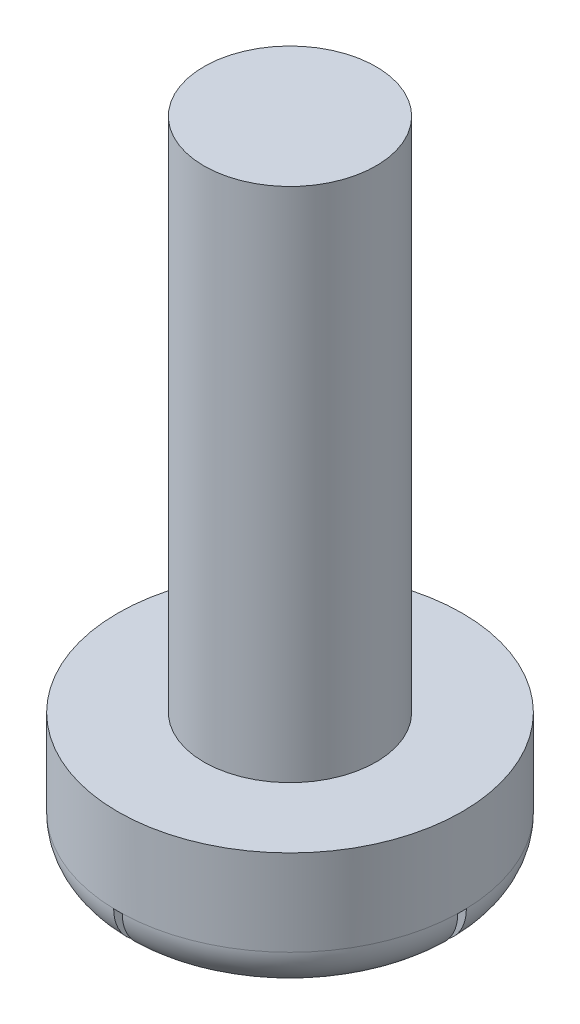
ISO-10303-21;
HEADER;
FILE_DESCRIPTION(('STEP AP214'),'2;1');
FILE_NAME('part.step','',(''),(''),'','','');
FILE_SCHEMA(('AUTOMOTIVE_DESIGN { 1 0 10303 214 1 1 1 1 }'));
ENDSEC;
DATA;
#1=APPLICATION_CONTEXT('core data for automotive mechanical design processes');
#2=APPLICATION_PROTOCOL_DEFINITION('international standard','automotive_design',2000,#1);
#3=PRODUCT_CONTEXT('',#1,'mechanical');
#4=PRODUCT('Part','Part','',(#3));
#5=PRODUCT_RELATED_PRODUCT_CATEGORY('part','',(#4));
#6=PRODUCT_DEFINITION_FORMATION('','',#4);
#7=PRODUCT_DEFINITION_CONTEXT('part definition',#1,'design');
#8=PRODUCT_DEFINITION('design','',#6,#7);
#9=PRODUCT_DEFINITION_SHAPE('','',#8);
#10=(LENGTH_UNIT() NAMED_UNIT(*) SI_UNIT(.MILLI.,.METRE.));
#11=(NAMED_UNIT(*) PLANE_ANGLE_UNIT() SI_UNIT($,.RADIAN.));
#12=(NAMED_UNIT(*) SI_UNIT($,.STERADIAN.) SOLID_ANGLE_UNIT());
#13=UNCERTAINTY_MEASURE_WITH_UNIT(LENGTH_MEASURE(1.E-05),#10,'distance_accuracy_value','');
#14=(GEOMETRIC_REPRESENTATION_CONTEXT(3) GLOBAL_UNCERTAINTY_ASSIGNED_CONTEXT((#13)) GLOBAL_UNIT_ASSIGNED_CONTEXT((#10,
#11,#12)) REPRESENTATION_CONTEXT('',''));
#15=CARTESIAN_POINT('',(0.,0.,0.));
#16=DIRECTION('',(0.,0.,1.));
#17=DIRECTION('',(1.,0.,0.));
#18=AXIS2_PLACEMENT_3D('',#15,#16,#17);
#19=CARTESIAN_POINT('',(0.,-3.,0.));
#20=DIRECTION('',(0.,1.,0.));
#21=DIRECTION('',(0.,0.,1.));
#22=AXIS2_PLACEMENT_3D('',#19,#20,#21);
#23=CYLINDRICAL_SURFACE('',#22,4.);
#24=CARTESIAN_POINT('',(0.,0.,0.));
#25=DIRECTION('',(0.,1.,0.));
#26=DIRECTION('',(0.,0.,1.));
#27=AXIS2_PLACEMENT_3D('',#24,#25,#26);
#28=CIRCLE('',#27,4.);
#29=CARTESIAN_POINT('',(0.,0.,4.));
#30=VERTEX_POINT('',#29);
#31=EDGE_CURVE('E244',#30,#30,#28,.T.);
#32=ORIENTED_EDGE('',*,*,#31,.F.);
#33=EDGE_LOOP('',(#32));
#34=FACE_BOUND('',#33,.T.);
#35=CARTESIAN_POINT('',(0.,-2.,0.));
#36=DIRECTION('',(0.,1.,0.));
#37=DIRECTION('',(0.,0.,1.));
#38=AXIS2_PLACEMENT_3D('',#35,#36,#37);
#39=CIRCLE('',#38,4.);
#40=CARTESIAN_POINT('',(0.100000000000001,-2.,3.99874980462644));
#41=VERTEX_POINT('',#40);
#42=CARTESIAN_POINT('',(-0.0999999999999993,-2.,3.99874980462644));
#43=VERTEX_POINT('',#42);
#44=EDGE_CURVE('E281',#41,#43,#39,.F.);
#45=ORIENTED_EDGE('',*,*,#44,.F.);
#46=CARTESIAN_POINT('',(0.,-2.,0.));
#47=DIRECTION('',(0.,1.,0.));
#48=DIRECTION('',(0.,0.,1.));
#49=AXIS2_PLACEMENT_3D('',#46,#47,#48);
#50=CIRCLE('',#49,4.);
#51=CARTESIAN_POINT('',(3.99874980462644,-2.,0.1));
#52=VERTEX_POINT('',#51);
#53=EDGE_CURVE('E294',#41,#52,#50,.T.);
#54=ORIENTED_EDGE('',*,*,#53,.T.);
#55=CARTESIAN_POINT('',(3.99874980462644,-2.,-0.1));
#56=VERTEX_POINT('',#55);
#57=EDGE_CURVE('E387',#56,#52,#39,.F.);
#58=ORIENTED_EDGE('',*,*,#57,.F.);
#59=CARTESIAN_POINT('',(0.,-2.,0.));
#60=DIRECTION('',(0.,1.,0.));
#61=DIRECTION('',(0.,0.,1.));
#62=AXIS2_PLACEMENT_3D('',#59,#60,#61);
#63=CIRCLE('',#62,4.);
#64=CARTESIAN_POINT('',(0.100000000000001,-2.,-3.99874980462644));
#65=VERTEX_POINT('',#64);
#66=EDGE_CURVE('E282',#56,#65,#63,.T.);
#67=ORIENTED_EDGE('',*,*,#66,.T.);
#68=CARTESIAN_POINT('',(-0.0999999999999993,-2.,-3.99874980462644));
#69=VERTEX_POINT('',#68);
#70=EDGE_CURVE('E278',#69,#65,#39,.F.);
#71=ORIENTED_EDGE('',*,*,#70,.F.);
#72=CARTESIAN_POINT('',(0.,-2.,0.));
#73=DIRECTION('',(0.,1.,0.));
#74=DIRECTION('',(0.,0.,1.));
#75=AXIS2_PLACEMENT_3D('',#72,#73,#74);
#76=CIRCLE('',#75,4.);
#77=CARTESIAN_POINT('',(-3.99874980462644,-2.,-0.1));
#78=VERTEX_POINT('',#77);
#79=EDGE_CURVE('E286',#69,#78,#76,.T.);
#80=ORIENTED_EDGE('',*,*,#79,.T.);
#81=CARTESIAN_POINT('',(-3.99874980462644,-2.,0.1));
#82=VERTEX_POINT('',#81);
#83=EDGE_CURVE('E196',#82,#78,#39,.F.);
#84=ORIENTED_EDGE('',*,*,#83,.F.);
#85=CARTESIAN_POINT('',(0.,-2.,0.));
#86=DIRECTION('',(0.,1.,0.));
#87=DIRECTION('',(0.,0.,1.));
#88=AXIS2_PLACEMENT_3D('',#85,#86,#87);
#89=CIRCLE('',#88,4.);
#90=EDGE_CURVE('E290',#82,#43,#89,.T.);
#91=ORIENTED_EDGE('',*,*,#90,.T.);
#92=EDGE_LOOP('',(#45,#54,#58,#67,#71,#80,#84,#91));
#93=FACE_BOUND('',#92,.T.);
#94=ADVANCED_FACE('F91',(#34,#93),#23,.T.);
#95=CARTESIAN_POINT('',(0.,-3.,0.));
#96=DIRECTION('',(0.,1.,0.));
#97=DIRECTION('',(0.,0.,1.));
#98=AXIS2_PLACEMENT_3D('',#95,#96,#97);
#99=PLANE('',#98);
#100=DIRECTION('',(1.,0.,0.));
#101=VECTOR('',#100,1.);
#102=CARTESIAN_POINT('',(0.,-3.,-0.1));
#103=LINE('',#102,#101);
#104=CARTESIAN_POINT('',(-2.99833287011299,-3.,-0.1));
#105=VERTEX_POINT('',#104);
#106=CARTESIAN_POINT('',(-0.0999999999999994,-3.,-0.1));
#107=VERTEX_POINT('',#106);
#108=EDGE_CURVE('E207',#105,#107,#103,.T.);
#109=ORIENTED_EDGE('',*,*,#108,.F.);
#110=CARTESIAN_POINT('',(0.,-3.,0.));
#111=DIRECTION('',(0.,1.,0.));
#112=DIRECTION('',(0.,0.,1.));
#113=AXIS2_PLACEMENT_3D('',#110,#111,#112);
#114=CIRCLE('',#113,3.);
#115=CARTESIAN_POINT('',(-0.0999999999999993,-3.,-2.99833287011299));
#116=VERTEX_POINT('',#115);
#117=EDGE_CURVE('E373',#105,#116,#114,.F.);
#118=ORIENTED_EDGE('',*,*,#117,.T.);
#119=DIRECTION('',(0.,0.,1.));
#120=VECTOR('',#119,1.);
#121=CARTESIAN_POINT('',(-0.0999999999999993,-3.,0.));
#122=LINE('',#121,#120);
#123=EDGE_CURVE('E273',#116,#107,#122,.T.);
#124=ORIENTED_EDGE('',*,*,#123,.T.);
#125=EDGE_LOOP('',(#109,#118,#124));
#126=FACE_BOUND('',#125,.T.);
#127=ADVANCED_FACE('F410',(#126),#99,.F.);
#128=DIRECTION('',(0.,0.,1.));
#129=VECTOR('',#128,1.);
#130=CARTESIAN_POINT('',(0.100000000000001,-3.,0.));
#131=LINE('',#130,#129);
#132=CARTESIAN_POINT('',(0.100000000000001,-3.,-2.99833287011299));
#133=VERTEX_POINT('',#132);
#134=CARTESIAN_POINT('',(0.100000000000001,-3.,-0.1));
#135=VERTEX_POINT('',#134);
#136=EDGE_CURVE('E267',#133,#135,#131,.T.);
#137=ORIENTED_EDGE('',*,*,#136,.F.);
#138=CARTESIAN_POINT('',(0.,-3.,0.));
#139=DIRECTION('',(0.,1.,0.));
#140=DIRECTION('',(0.,0.,1.));
#141=AXIS2_PLACEMENT_3D('',#138,#139,#140);
#142=CIRCLE('',#141,3.);
#143=CARTESIAN_POINT('',(2.99833287011299,-3.,-0.1));
#144=VERTEX_POINT('',#143);
#145=EDGE_CURVE('E106',#133,#144,#142,.F.);
#146=ORIENTED_EDGE('',*,*,#145,.T.);
#147=DIRECTION('',(1.,0.,0.));
#148=VECTOR('',#147,1.);
#149=CARTESIAN_POINT('',(0.,-3.,-0.1));
#150=LINE('',#149,#148);
#151=EDGE_CURVE('E270',#135,#144,#150,.T.);
#152=ORIENTED_EDGE('',*,*,#151,.F.);
#153=EDGE_LOOP('',(#137,#146,#152));
#154=FACE_BOUND('',#153,.T.);
#155=ADVANCED_FACE('F407',(#154),#99,.F.);
#156=DIRECTION('',(0.,0.,1.));
#157=VECTOR('',#156,1.);
#158=CARTESIAN_POINT('',(-0.0999999999999993,-3.,0.));
#159=LINE('',#158,#157);
#160=CARTESIAN_POINT('',(-0.0999999999999994,-3.,0.1));
#161=VERTEX_POINT('',#160);
#162=CARTESIAN_POINT('',(-0.0999999999999993,-3.,2.99833287011299));
#163=VERTEX_POINT('',#162);
#164=EDGE_CURVE('E260',#161,#163,#159,.T.);
#165=ORIENTED_EDGE('',*,*,#164,.T.);
#166=CARTESIAN_POINT('',(0.,-3.,0.));
#167=DIRECTION('',(0.,1.,0.));
#168=DIRECTION('',(0.,0.,1.));
#169=AXIS2_PLACEMENT_3D('',#166,#167,#168);
#170=CIRCLE('',#169,3.);
#171=CARTESIAN_POINT('',(-2.99833287011299,-3.,0.1));
#172=VERTEX_POINT('',#171);
#173=EDGE_CURVE('E333',#163,#172,#170,.F.);
#174=ORIENTED_EDGE('',*,*,#173,.T.);
#175=DIRECTION('',(1.,0.,0.));
#176=VECTOR('',#175,1.);
#177=CARTESIAN_POINT('',(0.,-3.,0.1));
#178=LINE('',#177,#176);
#179=EDGE_CURVE('E264',#172,#161,#178,.T.);
#180=ORIENTED_EDGE('',*,*,#179,.T.);
#181=EDGE_LOOP('',(#165,#174,#180));
#182=FACE_BOUND('',#181,.T.);
#183=ADVANCED_FACE('F409',(#182),#99,.F.);
#184=DIRECTION('',(1.,0.,0.));
#185=VECTOR('',#184,1.);
#186=CARTESIAN_POINT('',(0.,-3.,0.1));
#187=LINE('',#186,#185);
#188=CARTESIAN_POINT('',(0.100000000000001,-3.,0.0999999999999998));
#189=VERTEX_POINT('',#188);
#190=CARTESIAN_POINT('',(2.99833287011299,-3.,0.1));
#191=VERTEX_POINT('',#190);
#192=EDGE_CURVE('E256',#189,#191,#187,.T.);
#193=ORIENTED_EDGE('',*,*,#192,.T.);
#194=CARTESIAN_POINT('',(0.,-3.,0.));
#195=DIRECTION('',(0.,1.,0.));
#196=DIRECTION('',(0.,0.,1.));
#197=AXIS2_PLACEMENT_3D('',#194,#195,#196);
#198=CIRCLE('',#197,3.);
#199=CARTESIAN_POINT('',(0.100000000000001,-3.,2.99833287011299));
#200=VERTEX_POINT('',#199);
#201=EDGE_CURVE('E307',#191,#200,#198,.F.);
#202=ORIENTED_EDGE('',*,*,#201,.T.);
#203=DIRECTION('',(0.,0.,1.));
#204=VECTOR('',#203,1.);
#205=CARTESIAN_POINT('',(0.100000000000001,-3.,0.));
#206=LINE('',#205,#204);
#207=EDGE_CURVE('E249',#189,#200,#206,.T.);
#208=ORIENTED_EDGE('',*,*,#207,.F.);
#209=EDGE_LOOP('',(#193,#202,#208));
#210=FACE_BOUND('',#209,.T.);
#211=ADVANCED_FACE('F416',(#210),#99,.F.);
#212=CARTESIAN_POINT('',(0.,0.,0.));
#213=DIRECTION('',(0.,1.,0.));
#214=DIRECTION('',(0.,0.,1.));
#215=AXIS2_PLACEMENT_3D('',#212,#213,#214);
#216=PLANE('',#215);
#217=CARTESIAN_POINT('',(0.,0.,0.));
#218=DIRECTION('',(0.,1.,0.));
#219=DIRECTION('',(0.,0.,1.));
#220=AXIS2_PLACEMENT_3D('',#217,#218,#219);
#221=CIRCLE('',#220,2.);
#222=CARTESIAN_POINT('',(0.,0.,2.));
#223=VERTEX_POINT('',#222);
#224=EDGE_CURVE('E245',#223,#223,#221,.T.);
#225=ORIENTED_EDGE('',*,*,#224,.F.);
#226=EDGE_LOOP('',(#225));
#227=FACE_BOUND('',#226,.T.);
#228=ORIENTED_EDGE('',*,*,#31,.T.);
#229=EDGE_LOOP('',(#228));
#230=FACE_BOUND('',#229,.T.);
#231=ADVANCED_FACE('F426',(#227,#230),#216,.T.);
#232=CARTESIAN_POINT('',(0.,12.,0.));
#233=DIRECTION('',(0.,-1.,0.));
#234=DIRECTION('',(0.,0.,-1.));
#235=AXIS2_PLACEMENT_3D('',#232,#233,#234);
#236=CYLINDRICAL_SURFACE('',#235,2.);
#237=CARTESIAN_POINT('',(0.,12.,0.));
#238=DIRECTION('',(0.,1.,0.));
#239=DIRECTION('',(0.,0.,1.));
#240=AXIS2_PLACEMENT_3D('',#237,#238,#239);
#241=CIRCLE('',#240,2.);
#242=CARTESIAN_POINT('',(0.,12.,2.));
#243=VERTEX_POINT('',#242);
#244=EDGE_CURVE('E240',#243,#243,#241,.T.);
#245=ORIENTED_EDGE('',*,*,#244,.F.);
#246=EDGE_LOOP('',(#245));
#247=FACE_BOUND('',#246,.T.);
#248=ORIENTED_EDGE('',*,*,#224,.T.);
#249=EDGE_LOOP('',(#248));
#250=FACE_BOUND('',#249,.T.);
#251=ADVANCED_FACE('F428',(#247,#250),#236,.T.);
#252=CARTESIAN_POINT('',(0.,12.,0.));
#253=DIRECTION('',(0.,1.,0.));
#254=DIRECTION('',(0.,0.,1.));
#255=AXIS2_PLACEMENT_3D('',#252,#253,#254);
#256=PLANE('',#255);
#257=ORIENTED_EDGE('',*,*,#244,.T.);
#258=EDGE_LOOP('',(#257));
#259=FACE_BOUND('',#258,.T.);
#260=ADVANCED_FACE('F434',(#259),#256,.T.);
#261=CARTESIAN_POINT('',(-4.,-3.000012,-0.1));
#262=DIRECTION('',(0.,0.,1.));
#263=DIRECTION('',(1.,0.,0.));
#264=AXIS2_PLACEMENT_3D('',#261,#262,#263);
#265=PLANE('',#264);
#266=ORIENTED_EDGE('',*,*,#151,.T.);
#267=CARTESIAN_POINT('',(2.99833287011299,-3.,-0.1));
#268=CARTESIAN_POINT('',(3.02648915537228,-2.99999980789538,-0.1));
#269=CARTESIAN_POINT('',(3.05463197130798,-2.99881141081602,-0.1));
#270=CARTESIAN_POINT('',(3.11071638607154,-2.99407015262299,-0.1));
#271=CARTESIAN_POINT('',(3.13865799403641,-2.99051739956979,-0.1));
#272=CARTESIAN_POINT('',(3.22183290959604,-2.97634579201997,-0.1));
#273=CARTESIAN_POINT('',(3.27650931327191,-2.96221349837805,-0.1));
#274=CARTESIAN_POINT('',(3.38271216356528,-2.92496936902071,-0.1));
#275=CARTESIAN_POINT('',(3.43423704937304,-2.90185312496032,-0.1));
#276=CARTESIAN_POINT('',(3.53267105158687,-2.84729815429022,-0.1));
#277=CARTESIAN_POINT('',(3.57958100827151,-2.81586094660894,-0.1));
#278=CARTESIAN_POINT('',(3.66743734743857,-2.74556660055966,-0.1));
#279=CARTESIAN_POINT('',(3.7083857280629,-2.70671195843225,-0.1));
#280=CARTESIAN_POINT('',(3.78318382789451,-2.62266780817857,-0.1));
#281=CARTESIAN_POINT('',(3.8170321572465,-2.57747706262519,-0.1));
#282=CARTESIAN_POINT('',(3.87664941284173,-2.48206618759088,-0.1));
#283=CARTESIAN_POINT('',(3.90241992363654,-2.43184704703742,-0.1));
#284=CARTESIAN_POINT('',(3.94514813452206,-2.32780421094936,-0.1));
#285=CARTESIAN_POINT('',(3.9621110404358,-2.27398266593953,-0.1));
#286=CARTESIAN_POINT('',(3.98251413085547,-2.18319149144862,-0.1));
#287=CARTESIAN_POINT('',(3.9885988421359,-2.14679418941955,-0.1));
#288=CARTESIAN_POINT('',(3.99671612648229,-2.07360302371877,-0.1));
#289=CARTESIAN_POINT('',(3.99875444848536,-2.03680979744463,-0.1));
#290=CARTESIAN_POINT('',(3.99874980462644,-2.,-0.1));
#291=B_SPLINE_CURVE_WITH_KNOTS('',3,(#267,#268,#269,#270,#271,#272,#273,#274,#275,#276,#277,
#278,#279,#280,#281,#282,#283,#284,#285,#286,#287,#288,#289,#290),.UNSPECIFIED.,.F.,.F.,(4,2,2,
2,2,2,2,2,2,2,2,4),(0.,0.0844170174994972,0.1688301770706,0.337381032904328,0.50601469978765,
0.674617605085621,0.843163868990119,1.01174309558017,1.18028923280517,1.3487356354191,
1.45923346992142,1.56957420114066),.UNSPECIFIED.);
#292=EDGE_CURVE('E12',#144,#56,#291,.T.);
#293=ORIENTED_EDGE('',*,*,#292,.T.);
#294=DIRECTION('',(1.,0.,0.));
#295=VECTOR('',#294,1.);
#296=CARTESIAN_POINT('',(-4.,-2.,-0.1));
#297=LINE('',#296,#295);
#298=CARTESIAN_POINT('',(0.100000000000001,-2.,-0.1));
#299=VERTEX_POINT('',#298);
#300=EDGE_CURVE('E200',#299,#56,#297,.T.);
#301=ORIENTED_EDGE('',*,*,#300,.F.);
#302=DIRECTION('',(0.,-1.,0.));
#303=VECTOR('',#302,1.);
#304=CARTESIAN_POINT('',(0.100000000000001,-3.000012,-0.1));
#305=LINE('',#304,#303);
#306=EDGE_CURVE('E236',#299,#135,#305,.T.);
#307=ORIENTED_EDGE('',*,*,#306,.T.);
#308=EDGE_LOOP('',(#266,#293,#301,#307));
#309=FACE_BOUND('',#308,.T.);
#310=ADVANCED_FACE('F406',(#309),#265,.T.);
#311=CARTESIAN_POINT('',(-4.,-3.000012,0.1));
#312=DIRECTION('',(0.,0.,1.));
#313=DIRECTION('',(1.,0.,0.));
#314=AXIS2_PLACEMENT_3D('',#311,#312,#313);
#315=PLANE('',#314);
#316=DIRECTION('',(1.,0.,0.));
#317=VECTOR('',#316,1.);
#318=CARTESIAN_POINT('',(-4.,-2.,0.1));
#319=LINE('',#318,#317);
#320=CARTESIAN_POINT('',(0.100000000000001,-2.,0.1));
#321=VERTEX_POINT('',#320);
#322=EDGE_CURVE('E199',#321,#52,#319,.T.);
#323=ORIENTED_EDGE('',*,*,#322,.T.);
#324=CARTESIAN_POINT('',(3.99874980462644,-2.,0.1));
#325=CARTESIAN_POINT('',(3.99874962100237,-2.02812785839116,0.1));
#326=CARTESIAN_POINT('',(3.99756192385495,-2.05624223965923,0.1));
#327=CARTESIAN_POINT('',(3.9928237404935,-2.1122697814229,0.1));
#328=CARTESIAN_POINT('',(3.98927336875298,-2.1401829516011,0.1));
#329=CARTESIAN_POINT('',(3.97511208007223,-2.22327150684375,0.1));
#330=CARTESIAN_POINT('',(3.96099089546239,-2.2778902671302,0.1));
#331=CARTESIAN_POINT('',(3.92377993708066,-2.38398014583559,0.1));
#332=CARTESIAN_POINT('',(3.90068587929198,-2.43544974711014,0.1));
#333=CARTESIAN_POINT('',(3.84618787670218,-2.53378044221162,0.1));
#334=CARTESIAN_POINT('',(3.81478537885735,-2.58064233654639,0.1));
#335=CARTESIAN_POINT('',(3.74455815526252,-2.66843371294767,0.1));
#336=CARTESIAN_POINT('',(3.70573264566517,-2.7093625677001,0.1));
#337=CARTESIAN_POINT('',(3.62175401547384,-2.78413214354871,0.1));
#338=CARTESIAN_POINT('',(3.57659966146197,-2.81797147976575,0.1));
#339=CARTESIAN_POINT('',(3.48123424374425,-2.8776067032488,0.1));
#340=CARTESIAN_POINT('',(3.43102068811861,-2.90339860085723,0.1));
#341=CARTESIAN_POINT('',(3.32698712009897,-2.94617697723715,0.1));
#342=CARTESIAN_POINT('',(3.27316921069757,-2.96316854095931,0.1));
#343=CARTESIAN_POINT('',(3.18224250477201,-2.98365828318894,0.1));
#344=CARTESIAN_POINT('',(3.14570387552674,-2.98978285493069,0.1));
#345=CARTESIAN_POINT('',(3.0722261895924,-2.99795318397066,0.1));
#346=CARTESIAN_POINT('',(3.03528777705666,-3.0000047358939,0.1));
#347=CARTESIAN_POINT('',(2.99833287011299,-3.,0.1));
#348=B_SPLINE_CURVE_WITH_KNOTS('',3,(#324,#325,#326,#327,#328,#329,#330,#331,#332,#333,#334,
#335,#336,#337,#338,#339,#340,#341,#342,#343,#344,#345,#346,#347),.UNSPECIFIED.,.F.,.F.,(4,2,2,
2,2,2,2,2,2,2,2,4),(0.,0.0843317385586708,0.168659391473734,0.337035308081113,0.50549171322046,
0.673918800125343,0.842363682248771,1.01084143807761,1.17940258745201,1.34786623097359,
1.45879984574478,1.56957552348381),.UNSPECIFIED.);
#349=EDGE_CURVE('E298',#52,#191,#348,.T.);
#350=ORIENTED_EDGE('',*,*,#349,.T.);
#351=ORIENTED_EDGE('',*,*,#192,.F.);
#352=DIRECTION('',(0.,-1.,0.));
#353=VECTOR('',#352,1.);
#354=CARTESIAN_POINT('',(0.100000000000001,-3.000012,0.1));
#355=LINE('',#354,#353);
#356=EDGE_CURVE('E233',#321,#189,#355,.T.);
#357=ORIENTED_EDGE('',*,*,#356,.F.);
#358=EDGE_LOOP('',(#323,#350,#351,#357));
#359=FACE_BOUND('',#358,.T.);
#360=ADVANCED_FACE('F318',(#359),#315,.F.);
#361=CARTESIAN_POINT('',(-0.0999999999999994,-2.,-0.1));
#362=VERTEX_POINT('',#361);
#363=EDGE_CURVE('E187',#78,#362,#297,.T.);
#364=ORIENTED_EDGE('',*,*,#363,.F.);
#365=CARTESIAN_POINT('',(-3.99874980462644,-2.,-0.1));
#366=CARTESIAN_POINT('',(-3.99874962100237,-2.02812785839116,-0.1));
#367=CARTESIAN_POINT('',(-3.99756192385495,-2.05624223965923,-0.1));
#368=CARTESIAN_POINT('',(-3.9928237404935,-2.1122697814229,-0.1));
#369=CARTESIAN_POINT('',(-3.98927336875298,-2.1401829516011,-0.1));
#370=CARTESIAN_POINT('',(-3.97511208007223,-2.22327150684375,-0.1));
#371=CARTESIAN_POINT('',(-3.96099089546239,-2.2778902671302,-0.1));
#372=CARTESIAN_POINT('',(-3.92377993708066,-2.38398014583559,-0.1));
#373=CARTESIAN_POINT('',(-3.90068587929198,-2.43544974711014,-0.1));
#374=CARTESIAN_POINT('',(-3.84618787670218,-2.53378044221162,-0.1));
#375=CARTESIAN_POINT('',(-3.81478537885735,-2.58064233654639,-0.1));
#376=CARTESIAN_POINT('',(-3.74455815526252,-2.66843371294767,-0.1));
#377=CARTESIAN_POINT('',(-3.70573264566517,-2.7093625677001,-0.1));
#378=CARTESIAN_POINT('',(-3.62175401547384,-2.78413214354871,-0.1));
#379=CARTESIAN_POINT('',(-3.57659966146197,-2.81797147976575,-0.1));
#380=CARTESIAN_POINT('',(-3.48123424374425,-2.8776067032488,-0.1));
#381=CARTESIAN_POINT('',(-3.43102068811861,-2.90339860085723,-0.1));
#382=CARTESIAN_POINT('',(-3.32698712009897,-2.94617697723715,-0.1));
#383=CARTESIAN_POINT('',(-3.27316921069757,-2.96316854095931,-0.1));
#384=CARTESIAN_POINT('',(-3.18224250477201,-2.98365828318894,-0.1));
#385=CARTESIAN_POINT('',(-3.14570387552674,-2.98978285493069,-0.1));
#386=CARTESIAN_POINT('',(-3.0722261895924,-2.99795318397066,-0.1));
#387=CARTESIAN_POINT('',(-3.03528777705666,-3.0000047358939,-0.1));
#388=CARTESIAN_POINT('',(-2.99833287011299,-3.,-0.1));
#389=B_SPLINE_CURVE_WITH_KNOTS('',3,(#365,#366,#367,#368,#369,#370,#371,#372,#373,#374,#375,
#376,#377,#378,#379,#380,#381,#382,#383,#384,#385,#386,#387,#388),.UNSPECIFIED.,.F.,.F.,(4,2,2,
2,2,2,2,2,2,2,2,4),(0.,0.0843317385586708,0.168659391473734,0.337035308081113,0.50549171322046,
0.673918800125343,0.842363682248771,1.01084143807761,1.17940258745201,1.34786623097359,
1.45879984574478,1.56957552348381),.UNSPECIFIED.);
#390=EDGE_CURVE('E332',#78,#105,#389,.T.);
#391=ORIENTED_EDGE('',*,*,#390,.T.);
#392=ORIENTED_EDGE('',*,*,#108,.T.);
#393=DIRECTION('',(0.,1.,0.));
#394=VECTOR('',#393,1.);
#395=CARTESIAN_POINT('',(-0.0999999999999994,-2.,-0.1));
#396=LINE('',#395,#394);
#397=EDGE_CURVE('E204',#107,#362,#396,.T.);
#398=ORIENTED_EDGE('',*,*,#397,.T.);
#399=EDGE_LOOP('',(#364,#391,#392,#398));
#400=FACE_BOUND('',#399,.T.);
#401=ADVANCED_FACE('F205',(#400),#265,.T.);
#402=ORIENTED_EDGE('',*,*,#179,.F.);
#403=CARTESIAN_POINT('',(-2.99833287011299,-3.,0.1));
#404=CARTESIAN_POINT('',(-3.02648915537228,-2.99999980789538,0.1));
#405=CARTESIAN_POINT('',(-3.05463197130798,-2.99881141081602,0.1));
#406=CARTESIAN_POINT('',(-3.11071638607154,-2.99407015262299,0.1));
#407=CARTESIAN_POINT('',(-3.13865799403641,-2.99051739956979,0.1));
#408=CARTESIAN_POINT('',(-3.22183290959604,-2.97634579201997,0.1));
#409=CARTESIAN_POINT('',(-3.27650931327191,-2.96221349837805,0.1));
#410=CARTESIAN_POINT('',(-3.38271216356528,-2.92496936902071,0.1));
#411=CARTESIAN_POINT('',(-3.43423704937304,-2.90185312496032,0.1));
#412=CARTESIAN_POINT('',(-3.53267105158687,-2.84729815429022,0.1));
#413=CARTESIAN_POINT('',(-3.57958100827151,-2.81586094660894,0.1));
#414=CARTESIAN_POINT('',(-3.66743734743857,-2.74556660055966,0.1));
#415=CARTESIAN_POINT('',(-3.7083857280629,-2.70671195843225,0.1));
#416=CARTESIAN_POINT('',(-3.78318382789451,-2.62266780817857,0.1));
#417=CARTESIAN_POINT('',(-3.8170321572465,-2.57747706262519,0.1));
#418=CARTESIAN_POINT('',(-3.87664941284173,-2.48206618759088,0.1));
#419=CARTESIAN_POINT('',(-3.90241992363654,-2.43184704703742,0.1));
#420=CARTESIAN_POINT('',(-3.94514813452206,-2.32780421094936,0.1));
#421=CARTESIAN_POINT('',(-3.9621110404358,-2.27398266593953,0.1));
#422=CARTESIAN_POINT('',(-3.98251413085547,-2.18319149144862,0.1));
#423=CARTESIAN_POINT('',(-3.9885988421359,-2.14679418941955,0.1));
#424=CARTESIAN_POINT('',(-3.99671612648229,-2.07360302371877,0.1));
#425=CARTESIAN_POINT('',(-3.99875444848536,-2.03680979744463,0.1));
#426=CARTESIAN_POINT('',(-3.99874980462644,-2.,0.1));
#427=B_SPLINE_CURVE_WITH_KNOTS('',3,(#403,#404,#405,#406,#407,#408,#409,#410,#411,#412,#413,
#414,#415,#416,#417,#418,#419,#420,#421,#422,#423,#424,#425,#426),.UNSPECIFIED.,.F.,.F.,(4,2,2,
2,2,2,2,2,2,2,2,4),(0.,0.0844170174994972,0.1688301770706,0.337381032904328,0.50601469978765,
0.674617605085621,0.843163868990119,1.01174309558017,1.18028923280517,1.3487356354191,
1.45923346992142,1.56957420114066),.UNSPECIFIED.);
#428=EDGE_CURVE('E324',#172,#82,#427,.T.);
#429=ORIENTED_EDGE('',*,*,#428,.T.);
#430=CARTESIAN_POINT('',(-0.0999999999999994,-2.,0.1));
#431=VERTEX_POINT('',#430);
#432=EDGE_CURVE('E230',#82,#431,#319,.T.);
#433=ORIENTED_EDGE('',*,*,#432,.T.);
#434=DIRECTION('',(0.,1.,0.));
#435=VECTOR('',#434,1.);
#436=CARTESIAN_POINT('',(-0.0999999999999994,-2.,0.1));
#437=LINE('',#436,#435);
#438=EDGE_CURVE('E211',#161,#431,#437,.T.);
#439=ORIENTED_EDGE('',*,*,#438,.F.);
#440=EDGE_LOOP('',(#402,#429,#433,#439));
#441=FACE_BOUND('',#440,.T.);
#442=ADVANCED_FACE('F313',(#441),#315,.F.);
#443=CARTESIAN_POINT('',(-0.0999999999999993,-2.,4.));
#444=DIRECTION('',(-1.,0.,0.));
#445=DIRECTION('',(0.,0.,1.));
#446=AXIS2_PLACEMENT_3D('',#443,#444,#445);
#447=PLANE('',#446);
#448=ORIENTED_EDGE('',*,*,#123,.F.);
#449=CARTESIAN_POINT('',(-0.0999999999999993,-3.,-2.99833287011299));
#450=CARTESIAN_POINT('',(-0.0999999999999993,-2.99999980789538,-3.02648915537228));
#451=CARTESIAN_POINT('',(-0.0999999999999993,-2.99881141081602,-3.05463197130798));
#452=CARTESIAN_POINT('',(-0.0999999999999993,-2.99407015262299,-3.11071638607154));
#453=CARTESIAN_POINT('',(-0.0999999999999993,-2.99051739956979,-3.13865799403641));
#454=CARTESIAN_POINT('',(-0.0999999999999993,-2.97634579201997,-3.22183290959604));
#455=CARTESIAN_POINT('',(-0.0999999999999993,-2.96221349837805,-3.27650931327191));
#456=CARTESIAN_POINT('',(-0.0999999999999993,-2.92496936902071,-3.38271216356528));
#457=CARTESIAN_POINT('',(-0.0999999999999993,-2.90185312496032,-3.43423704937304));
#458=CARTESIAN_POINT('',(-0.0999999999999993,-2.84729815429022,-3.53267105158687));
#459=CARTESIAN_POINT('',(-0.0999999999999993,-2.81586094660894,-3.57958100827151));
#460=CARTESIAN_POINT('',(-0.0999999999999993,-2.74556660055966,-3.66743734743857));
#461=CARTESIAN_POINT('',(-0.0999999999999993,-2.70671195843225,-3.7083857280629));
#462=CARTESIAN_POINT('',(-0.0999999999999993,-2.62266780817857,-3.78318382789451));
#463=CARTESIAN_POINT('',(-0.0999999999999993,-2.57747706262519,-3.81703215724649));
#464=CARTESIAN_POINT('',(-0.0999999999999993,-2.48206618759088,-3.87664941284173));
#465=CARTESIAN_POINT('',(-0.0999999999999993,-2.43184704703742,-3.90241992363654));
#466=CARTESIAN_POINT('',(-0.0999999999999993,-2.32780421094936,-3.94514813452206));
#467=CARTESIAN_POINT('',(-0.0999999999999993,-2.27398266593953,-3.9621110404358));
#468=CARTESIAN_POINT('',(-0.0999999999999993,-2.18319149144862,-3.98251413085547));
#469=CARTESIAN_POINT('',(-0.0999999999999993,-2.14679418941955,-3.9885988421359));
#470=CARTESIAN_POINT('',(-0.0999999999999993,-2.07360302371877,-3.99671612648229));
#471=CARTESIAN_POINT('',(-0.0999999999999993,-2.03680979744463,-3.99875444848536));
#472=CARTESIAN_POINT('',(-0.0999999999999993,-2.,-3.99874980462644));
#473=B_SPLINE_CURVE_WITH_KNOTS('',3,(#449,#450,#451,#452,#453,#454,#455,#456,#457,#458,#459,
#460,#461,#462,#463,#464,#465,#466,#467,#468,#469,#470,#471,#472),.UNSPECIFIED.,.F.,.F.,(4,2,2,
2,2,2,2,2,2,2,2,4),(0.,0.0844170174994972,0.1688301770706,0.337381032904328,0.50601469978765,
0.674617605085621,0.843163868990119,1.01174309558017,1.18028923280517,1.3487356354191,
1.45923346992142,1.56957420114066),.UNSPECIFIED.);
#474=EDGE_CURVE('E215',#116,#69,#473,.T.);
#475=ORIENTED_EDGE('',*,*,#474,.T.);
#476=DIRECTION('',(0.,0.,1.));
#477=VECTOR('',#476,1.);
#478=CARTESIAN_POINT('',(-0.0999999999999993,-2.,4.));
#479=LINE('',#478,#477);
#480=EDGE_CURVE('E193',#362,#69,#479,.F.);
#481=ORIENTED_EDGE('',*,*,#480,.F.);
#482=ORIENTED_EDGE('',*,*,#397,.F.);
#483=EDGE_LOOP('',(#448,#475,#481,#482));
#484=FACE_BOUND('',#483,.T.);
#485=ADVANCED_FACE('F213',(#484),#447,.F.);
#486=CARTESIAN_POINT('',(0.100000000000001,-2.,4.));
#487=DIRECTION('',(-1.,0.,0.));
#488=DIRECTION('',(0.,0.,1.));
#489=AXIS2_PLACEMENT_3D('',#486,#487,#488);
#490=PLANE('',#489);
#491=DIRECTION('',(0.,0.,1.));
#492=VECTOR('',#491,1.);
#493=CARTESIAN_POINT('',(0.100000000000001,-2.,4.));
#494=LINE('',#493,#492);
#495=EDGE_CURVE('E222',#299,#65,#494,.F.);
#496=ORIENTED_EDGE('',*,*,#495,.T.);
#497=CARTESIAN_POINT('',(0.100000000000001,-2.,-3.99874980462644));
#498=CARTESIAN_POINT('',(0.100000000000001,-2.02812785839116,-3.99874962100237));
#499=CARTESIAN_POINT('',(0.100000000000001,-2.05624223965923,-3.99756192385495));
#500=CARTESIAN_POINT('',(0.100000000000001,-2.1122697814229,-3.9928237404935));
#501=CARTESIAN_POINT('',(0.100000000000001,-2.1401829516011,-3.98927336875298));
#502=CARTESIAN_POINT('',(0.100000000000001,-2.22327150684375,-3.97511208007223));
#503=CARTESIAN_POINT('',(0.100000000000001,-2.2778902671302,-3.96099089546239));
#504=CARTESIAN_POINT('',(0.100000000000001,-2.38398014583559,-3.92377993708066));
#505=CARTESIAN_POINT('',(0.100000000000001,-2.43544974711014,-3.90068587929198));
#506=CARTESIAN_POINT('',(0.100000000000001,-2.53378044221162,-3.84618787670218));
#507=CARTESIAN_POINT('',(0.100000000000001,-2.58064233654639,-3.81478537885735));
#508=CARTESIAN_POINT('',(0.100000000000001,-2.66843371294767,-3.74455815526252));
#509=CARTESIAN_POINT('',(0.100000000000001,-2.7093625677001,-3.70573264566517));
#510=CARTESIAN_POINT('',(0.100000000000001,-2.78413214354871,-3.62175401547384));
#511=CARTESIAN_POINT('',(0.100000000000001,-2.81797147976575,-3.57659966146197));
#512=CARTESIAN_POINT('',(0.100000000000001,-2.8776067032488,-3.48123424374425));
#513=CARTESIAN_POINT('',(0.100000000000001,-2.90339860085723,-3.43102068811861));
#514=CARTESIAN_POINT('',(0.100000000000001,-2.94617697723715,-3.32698712009897));
#515=CARTESIAN_POINT('',(0.100000000000001,-2.96316854095931,-3.27316921069757));
#516=CARTESIAN_POINT('',(0.100000000000001,-2.98365828318894,-3.18224250477201));
#517=CARTESIAN_POINT('',(0.100000000000001,-2.98978285493069,-3.14570387552674));
#518=CARTESIAN_POINT('',(0.100000000000001,-2.99795318397066,-3.0722261895924));
#519=CARTESIAN_POINT('',(0.100000000000001,-3.0000047358939,-3.03528777705666));
#520=CARTESIAN_POINT('',(0.100000000000001,-3.,-2.99833287011299));
#521=B_SPLINE_CURVE_WITH_KNOTS('',3,(#497,#498,#499,#500,#501,#502,#503,#504,#505,#506,#507,
#508,#509,#510,#511,#512,#513,#514,#515,#516,#517,#518,#519,#520),.UNSPECIFIED.,.F.,.F.,(4,2,2,
2,2,2,2,2,2,2,2,4),(0.,0.0843317385586708,0.168659391473734,0.337035308081113,0.50549171322046,
0.673918800125343,0.842363682248771,1.01084143807761,1.17940258745201,1.34786623097359,
1.45879984574478,1.56957552348381),.UNSPECIFIED.);
#522=EDGE_CURVE('E120',#65,#133,#521,.T.);
#523=ORIENTED_EDGE('',*,*,#522,.T.);
#524=ORIENTED_EDGE('',*,*,#136,.T.);
#525=ORIENTED_EDGE('',*,*,#306,.F.);
#526=EDGE_LOOP('',(#496,#523,#524,#525));
#527=FACE_BOUND('',#526,.T.);
#528=ADVANCED_FACE('F397',(#527),#490,.T.);
#529=CARTESIAN_POINT('',(0.,-2.,0.));
#530=DIRECTION('',(0.,1.,0.));
#531=DIRECTION('',(-1.,0.,0.));
#532=AXIS2_PLACEMENT_3D('',#529,#530,#531);
#533=PLANE('',#532);
#534=ORIENTED_EDGE('',*,*,#432,.F.);
#535=ORIENTED_EDGE('',*,*,#83,.T.);
#536=ORIENTED_EDGE('',*,*,#363,.T.);
#537=ORIENTED_EDGE('',*,*,#480,.T.);
#538=ORIENTED_EDGE('',*,*,#70,.T.);
#539=ORIENTED_EDGE('',*,*,#495,.F.);
#540=ORIENTED_EDGE('',*,*,#300,.T.);
#541=ORIENTED_EDGE('',*,*,#57,.T.);
#542=ORIENTED_EDGE('',*,*,#322,.F.);
#543=EDGE_CURVE('E224',#41,#321,#494,.F.);
#544=ORIENTED_EDGE('',*,*,#543,.F.);
#545=ORIENTED_EDGE('',*,*,#44,.T.);
#546=EDGE_CURVE('E218',#43,#431,#479,.F.);
#547=ORIENTED_EDGE('',*,*,#546,.T.);
#548=EDGE_LOOP('',(#534,#535,#536,#537,#538,#539,#540,#541,#542,#544,#545,#547));
#549=FACE_BOUND('',#548,.T.);
#550=ADVANCED_FACE('F190',(#549),#533,.F.);
#551=ORIENTED_EDGE('',*,*,#546,.F.);
#552=CARTESIAN_POINT('',(-0.0999999999999993,-2.,3.99874980462644));
#553=CARTESIAN_POINT('',(-0.0999999999999993,-2.02812785839116,3.99874962100237));
#554=CARTESIAN_POINT('',(-0.0999999999999993,-2.05624223965923,3.99756192385495));
#555=CARTESIAN_POINT('',(-0.0999999999999993,-2.1122697814229,3.9928237404935));
#556=CARTESIAN_POINT('',(-0.0999999999999993,-2.1401829516011,3.98927336875298));
#557=CARTESIAN_POINT('',(-0.0999999999999993,-2.22327150684375,3.97511208007223));
#558=CARTESIAN_POINT('',(-0.0999999999999993,-2.2778902671302,3.96099089546239));
#559=CARTESIAN_POINT('',(-0.0999999999999993,-2.38398014583559,3.92377993708066));
#560=CARTESIAN_POINT('',(-0.0999999999999993,-2.43544974711014,3.90068587929198));
#561=CARTESIAN_POINT('',(-0.0999999999999993,-2.53378044221162,3.84618787670218));
#562=CARTESIAN_POINT('',(-0.0999999999999993,-2.58064233654639,3.81478537885735));
#563=CARTESIAN_POINT('',(-0.0999999999999993,-2.66843371294767,3.74455815526252));
#564=CARTESIAN_POINT('',(-0.0999999999999993,-2.7093625677001,3.70573264566517));
#565=CARTESIAN_POINT('',(-0.0999999999999993,-2.78413214354871,3.62175401547384));
#566=CARTESIAN_POINT('',(-0.0999999999999993,-2.81797147976575,3.57659966146197));
#567=CARTESIAN_POINT('',(-0.0999999999999993,-2.8776067032488,3.48123424374425));
#568=CARTESIAN_POINT('',(-0.0999999999999993,-2.90339860085723,3.43102068811861));
#569=CARTESIAN_POINT('',(-0.0999999999999993,-2.94617697723715,3.32698712009897));
#570=CARTESIAN_POINT('',(-0.0999999999999993,-2.96316854095931,3.27316921069757));
#571=CARTESIAN_POINT('',(-0.0999999999999993,-2.98365828318894,3.18224250477201));
#572=CARTESIAN_POINT('',(-0.0999999999999993,-2.98978285493069,3.14570387552674));
#573=CARTESIAN_POINT('',(-0.0999999999999993,-2.99795318397066,3.0722261895924));
#574=CARTESIAN_POINT('',(-0.0999999999999993,-3.0000047358939,3.03528777705666));
#575=CARTESIAN_POINT('',(-0.0999999999999993,-3.,2.99833287011299));
#576=B_SPLINE_CURVE_WITH_KNOTS('',3,(#552,#553,#554,#555,#556,#557,#558,#559,#560,#561,#562,
#563,#564,#565,#566,#567,#568,#569,#570,#571,#572,#573,#574,#575),.UNSPECIFIED.,.F.,.F.,(4,2,2,
2,2,2,2,2,2,2,2,4),(0.,0.0843317385586708,0.168659391473734,0.337035308081113,0.50549171322046,
0.673918800125343,0.842363682248771,1.01084143807761,1.17940258745201,1.34786623097359,
1.45879984574478,1.56957552348381),.UNSPECIFIED.);
#577=EDGE_CURVE('E347',#43,#163,#576,.T.);
#578=ORIENTED_EDGE('',*,*,#577,.T.);
#579=ORIENTED_EDGE('',*,*,#164,.F.);
#580=ORIENTED_EDGE('',*,*,#438,.T.);
#581=EDGE_LOOP('',(#551,#578,#579,#580));
#582=FACE_BOUND('',#581,.T.);
#583=ADVANCED_FACE('F359',(#582),#447,.F.);
#584=ORIENTED_EDGE('',*,*,#207,.T.);
#585=CARTESIAN_POINT('',(0.100000000000001,-3.,2.99833287011299));
#586=CARTESIAN_POINT('',(0.100000000000001,-2.99999980789538,3.02648915537228));
#587=CARTESIAN_POINT('',(0.100000000000001,-2.99881141081602,3.05463197130798));
#588=CARTESIAN_POINT('',(0.100000000000001,-2.99407015262299,3.11071638607154));
#589=CARTESIAN_POINT('',(0.100000000000001,-2.99051739956979,3.13865799403641));
#590=CARTESIAN_POINT('',(0.100000000000001,-2.97634579201997,3.22183290959604));
#591=CARTESIAN_POINT('',(0.100000000000001,-2.96221349837805,3.27650931327191));
#592=CARTESIAN_POINT('',(0.100000000000001,-2.92496936902071,3.38271216356528));
#593=CARTESIAN_POINT('',(0.100000000000001,-2.90185312496032,3.43423704937304));
#594=CARTESIAN_POINT('',(0.100000000000001,-2.84729815429022,3.53267105158687));
#595=CARTESIAN_POINT('',(0.100000000000001,-2.81586094660894,3.57958100827151));
#596=CARTESIAN_POINT('',(0.100000000000001,-2.74556660055966,3.66743734743857));
#597=CARTESIAN_POINT('',(0.100000000000001,-2.70671195843225,3.7083857280629));
#598=CARTESIAN_POINT('',(0.100000000000001,-2.62266780817857,3.78318382789451));
#599=CARTESIAN_POINT('',(0.100000000000001,-2.57747706262519,3.8170321572465));
#600=CARTESIAN_POINT('',(0.100000000000001,-2.48206618759088,3.87664941284173));
#601=CARTESIAN_POINT('',(0.100000000000001,-2.43184704703742,3.90241992363654));
#602=CARTESIAN_POINT('',(0.100000000000001,-2.32780421094936,3.94514813452206));
#603=CARTESIAN_POINT('',(0.100000000000001,-2.27398266593953,3.9621110404358));
#604=CARTESIAN_POINT('',(0.100000000000001,-2.18319149144862,3.98251413085547));
#605=CARTESIAN_POINT('',(0.100000000000001,-2.14679418941955,3.9885988421359));
#606=CARTESIAN_POINT('',(0.100000000000001,-2.07360302371877,3.99671612648229));
#607=CARTESIAN_POINT('',(0.100000000000001,-2.03680979744463,3.99875444848536));
#608=CARTESIAN_POINT('',(0.100000000000001,-2.,3.99874980462644));
#609=B_SPLINE_CURVE_WITH_KNOTS('',3,(#585,#586,#587,#588,#589,#590,#591,#592,#593,#594,#595,
#596,#597,#598,#599,#600,#601,#602,#603,#604,#605,#606,#607,#608),.UNSPECIFIED.,.F.,.F.,(4,2,2,
2,2,2,2,2,2,2,2,4),(0.,0.0844170174994972,0.1688301770706,0.337381032904328,0.50601469978765,
0.674617605085621,0.843163868990119,1.01174309558017,1.18028923280517,1.3487356354191,
1.45923346992142,1.56957420114066),.UNSPECIFIED.);
#610=EDGE_CURVE('E353',#200,#41,#609,.T.);
#611=ORIENTED_EDGE('',*,*,#610,.T.);
#612=ORIENTED_EDGE('',*,*,#543,.T.);
#613=ORIENTED_EDGE('',*,*,#356,.T.);
#614=EDGE_LOOP('',(#584,#611,#612,#613));
#615=FACE_BOUND('',#614,.T.);
#616=ADVANCED_FACE('F362',(#615),#490,.T.);
#617=CARTESIAN_POINT('',(0.,-2.,0.));
#618=DIRECTION('',(0.,1.,0.));
#619=DIRECTION('',(0.,0.,1.));
#620=AXIS2_PLACEMENT_3D('',#617,#618,#619);
#621=TOROIDAL_SURFACE('',#620,3.,1.);
#622=ORIENTED_EDGE('',*,*,#610,.F.);
#623=ORIENTED_EDGE('',*,*,#201,.F.);
#624=ORIENTED_EDGE('',*,*,#349,.F.);
#625=ORIENTED_EDGE('',*,*,#53,.F.);
#626=EDGE_LOOP('',(#622,#623,#624,#625));
#627=FACE_BOUND('',#626,.T.);
#628=ADVANCED_FACE('F309',(#627),#621,.T.);
#629=CARTESIAN_POINT('',(0.,-2.,0.));
#630=DIRECTION('',(0.,1.,0.));
#631=DIRECTION('',(0.,0.,1.));
#632=AXIS2_PLACEMENT_3D('',#629,#630,#631);
#633=TOROIDAL_SURFACE('',#632,3.,1.);
#634=ORIENTED_EDGE('',*,*,#428,.F.);
#635=ORIENTED_EDGE('',*,*,#173,.F.);
#636=ORIENTED_EDGE('',*,*,#577,.F.);
#637=ORIENTED_EDGE('',*,*,#90,.F.);
#638=EDGE_LOOP('',(#634,#635,#636,#637));
#639=FACE_BOUND('',#638,.T.);
#640=ADVANCED_FACE('F340',(#639),#633,.T.);
#641=CARTESIAN_POINT('',(0.,-2.,0.));
#642=DIRECTION('',(0.,1.,0.));
#643=DIRECTION('',(0.,0.,1.));
#644=AXIS2_PLACEMENT_3D('',#641,#642,#643);
#645=TOROIDAL_SURFACE('',#644,3.,1.);
#646=ORIENTED_EDGE('',*,*,#474,.F.);
#647=ORIENTED_EDGE('',*,*,#117,.F.);
#648=ORIENTED_EDGE('',*,*,#390,.F.);
#649=ORIENTED_EDGE('',*,*,#79,.F.);
#650=EDGE_LOOP('',(#646,#647,#648,#649));
#651=FACE_BOUND('',#650,.T.);
#652=ADVANCED_FACE('F343',(#651),#645,.T.);
#653=CARTESIAN_POINT('',(0.,-2.,0.));
#654=DIRECTION('',(0.,1.,0.));
#655=DIRECTION('',(0.,0.,1.));
#656=AXIS2_PLACEMENT_3D('',#653,#654,#655);
#657=TOROIDAL_SURFACE('',#656,3.,1.);
#658=ORIENTED_EDGE('',*,*,#292,.F.);
#659=ORIENTED_EDGE('',*,*,#145,.F.);
#660=ORIENTED_EDGE('',*,*,#522,.F.);
#661=ORIENTED_EDGE('',*,*,#66,.F.);
#662=EDGE_LOOP('',(#658,#659,#660,#661));
#663=FACE_BOUND('',#662,.T.);
#664=ADVANCED_FACE('F93',(#663),#657,.T.);
#665=CLOSED_SHELL('',(#94,#127,#155,#183,#211,#231,#251,#260,#310,#360,#401,#442,#485,#528,#550,
#583,#616,#628,#640,#652,#664));
#666=MANIFOLD_SOLID_BREP('B2',#665);
#667=ADVANCED_BREP_SHAPE_REPRESENTATION('',(#18,#666),#14);
#668=SHAPE_DEFINITION_REPRESENTATION(#9,#667);
ENDSEC;
END-ISO-10303-21;
